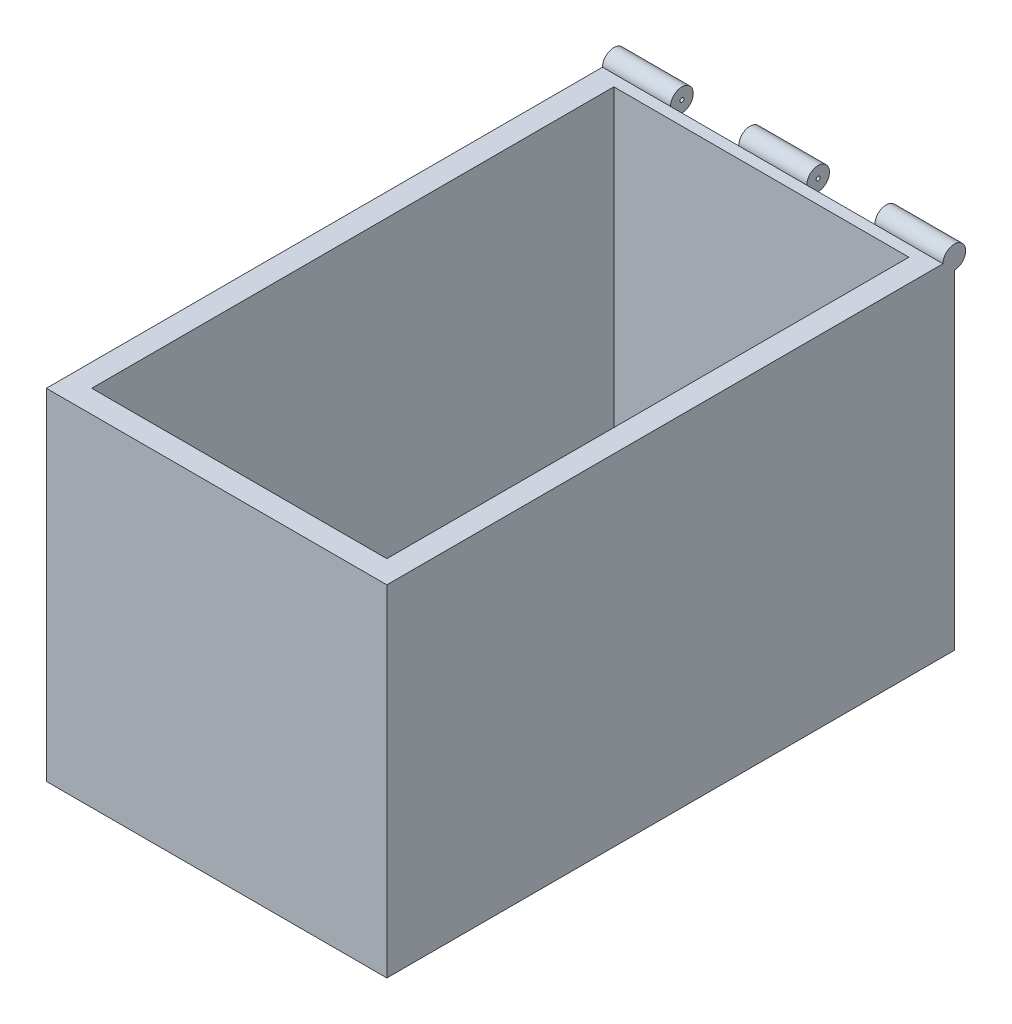
ISO-10303-21;
HEADER;
FILE_DESCRIPTION(('STEP AP214'),'2;1');
FILE_NAME('part.step','',(''),(''),'','','');
FILE_SCHEMA(('AUTOMOTIVE_DESIGN { 1 0 10303 214 1 1 1 1 }'));
ENDSEC;
DATA;
#1=APPLICATION_CONTEXT('core data for automotive mechanical design processes');
#2=APPLICATION_PROTOCOL_DEFINITION('international standard','automotive_design',2000,#1);
#3=PRODUCT_CONTEXT('',#1,'mechanical');
#4=PRODUCT('Part','Part','',(#3));
#5=PRODUCT_RELATED_PRODUCT_CATEGORY('part','',(#4));
#6=PRODUCT_DEFINITION_FORMATION('','',#4);
#7=PRODUCT_DEFINITION_CONTEXT('part definition',#1,'design');
#8=PRODUCT_DEFINITION('design','',#6,#7);
#9=PRODUCT_DEFINITION_SHAPE('','',#8);
#10=(LENGTH_UNIT() NAMED_UNIT(*) SI_UNIT(.MILLI.,.METRE.));
#11=(NAMED_UNIT(*) PLANE_ANGLE_UNIT() SI_UNIT($,.RADIAN.));
#12=(NAMED_UNIT(*) SI_UNIT($,.STERADIAN.) SOLID_ANGLE_UNIT());
#13=UNCERTAINTY_MEASURE_WITH_UNIT(LENGTH_MEASURE(1.E-05),#10,'distance_accuracy_value','');
#14=(GEOMETRIC_REPRESENTATION_CONTEXT(3) GLOBAL_UNCERTAINTY_ASSIGNED_CONTEXT((#13)) GLOBAL_UNIT_ASSIGNED_CONTEXT((#10,
#11,#12)) REPRESENTATION_CONTEXT('',''));
#15=CARTESIAN_POINT('',(0.,0.,0.));
#16=DIRECTION('',(0.,0.,1.));
#17=DIRECTION('',(1.,0.,0.));
#18=AXIS2_PLACEMENT_3D('',#15,#16,#17);
#19=CARTESIAN_POINT('',(0.,150.,250.));
#20=DIRECTION('',(0.,-1.,0.));
#21=DIRECTION('',(0.,0.,-1.));
#22=AXIS2_PLACEMENT_3D('',#19,#20,#21);
#23=PLANE('',#22);
#24=DIRECTION('',(-1.,0.,0.));
#25=VECTOR('',#24,1.);
#26=CARTESIAN_POINT('',(0.,150.,10.));
#27=LINE('',#26,#25);
#28=CARTESIAN_POINT('',(140.,150.,10.));
#29=VERTEX_POINT('',#28);
#30=CARTESIAN_POINT('',(10.,150.,10.));
#31=VERTEX_POINT('',#30);
#32=EDGE_CURVE('E358',#29,#31,#27,.T.);
#33=ORIENTED_EDGE('',*,*,#32,.F.);
#34=DIRECTION('',(0.,0.,-1.));
#35=VECTOR('',#34,1.);
#36=CARTESIAN_POINT('',(140.,150.,250.));
#37=LINE('',#36,#35);
#38=CARTESIAN_POINT('',(140.,150.,240.));
#39=VERTEX_POINT('',#38);
#40=EDGE_CURVE('E367',#39,#29,#37,.T.);
#41=ORIENTED_EDGE('',*,*,#40,.F.);
#42=DIRECTION('',(-1.,0.,0.));
#43=VECTOR('',#42,1.);
#44=CARTESIAN_POINT('',(0.,150.,240.));
#45=LINE('',#44,#43);
#46=CARTESIAN_POINT('',(10.,150.,240.));
#47=VERTEX_POINT('',#46);
#48=EDGE_CURVE('E378',#39,#47,#45,.T.);
#49=ORIENTED_EDGE('',*,*,#48,.T.);
#50=DIRECTION('',(0.,0.,-1.));
#51=VECTOR('',#50,1.);
#52=CARTESIAN_POINT('',(10.,150.,250.));
#53=LINE('',#52,#51);
#54=EDGE_CURVE('E379',#47,#31,#53,.T.);
#55=ORIENTED_EDGE('',*,*,#54,.T.);
#56=EDGE_LOOP('',(#33,#41,#49,#55));
#57=FACE_BOUND('',#56,.T.);
#58=DIRECTION('',(0.,0.,-1.));
#59=VECTOR('',#58,1.);
#60=CARTESIAN_POINT('',(150.,150.,250.));
#61=LINE('',#60,#59);
#62=CARTESIAN_POINT('',(150.,150.,250.));
#63=VERTEX_POINT('',#62);
#64=CARTESIAN_POINT('',(150.,150.,5.));
#65=VERTEX_POINT('',#64);
#66=EDGE_CURVE('E210',#63,#65,#61,.T.);
#67=ORIENTED_EDGE('',*,*,#66,.T.);
#68=DIRECTION('',(-1.,0.,0.));
#69=VECTOR('',#68,1.);
#70=CARTESIAN_POINT('',(150.,150.,5.));
#71=LINE('',#70,#69);
#72=CARTESIAN_POINT('',(120.,150.,5.));
#73=VERTEX_POINT('',#72);
#74=EDGE_CURVE('E190',#65,#73,#71,.T.);
#75=ORIENTED_EDGE('',*,*,#74,.T.);
#76=DIRECTION('',(-1.,0.,0.));
#77=VECTOR('',#76,1.);
#78=CARTESIAN_POINT('',(120.,150.,5.));
#79=LINE('',#78,#77);
#80=CARTESIAN_POINT('',(90.,150.,5.));
#81=VERTEX_POINT('',#80);
#82=EDGE_CURVE('E206',#81,#73,#79,.F.);
#83=ORIENTED_EDGE('',*,*,#82,.F.);
#84=DIRECTION('',(-1.,0.,0.));
#85=VECTOR('',#84,1.);
#86=CARTESIAN_POINT('',(90.,150.,5.00000000000001));
#87=LINE('',#86,#85);
#88=CARTESIAN_POINT('',(60.,150.,5.00000000000001));
#89=VERTEX_POINT('',#88);
#90=EDGE_CURVE('E242',#81,#89,#87,.T.);
#91=ORIENTED_EDGE('',*,*,#90,.T.);
#92=DIRECTION('',(-1.,0.,0.));
#93=VECTOR('',#92,1.);
#94=CARTESIAN_POINT('',(60.,150.,5.00000000000001));
#95=LINE('',#94,#93);
#96=CARTESIAN_POINT('',(30.,150.,5.00000000000001));
#97=VERTEX_POINT('',#96);
#98=EDGE_CURVE('E256',#97,#89,#95,.F.);
#99=ORIENTED_EDGE('',*,*,#98,.F.);
#100=DIRECTION('',(-1.,0.,0.));
#101=VECTOR('',#100,1.);
#102=CARTESIAN_POINT('',(30.,150.,5.));
#103=LINE('',#102,#101);
#104=CARTESIAN_POINT('',(0.,150.,5.));
#105=VERTEX_POINT('',#104);
#106=EDGE_CURVE('E264',#97,#105,#103,.T.);
#107=ORIENTED_EDGE('',*,*,#106,.T.);
#108=DIRECTION('',(0.,0.,-1.));
#109=VECTOR('',#108,1.);
#110=CARTESIAN_POINT('',(0.,150.,250.));
#111=LINE('',#110,#109);
#112=CARTESIAN_POINT('',(0.,150.,250.));
#113=VERTEX_POINT('',#112);
#114=EDGE_CURVE('E405',#113,#105,#111,.T.);
#115=ORIENTED_EDGE('',*,*,#114,.F.);
#116=DIRECTION('',(-1.,0.,0.));
#117=VECTOR('',#116,1.);
#118=CARTESIAN_POINT('',(0.,150.,250.));
#119=LINE('',#118,#117);
#120=EDGE_CURVE('E402',#63,#113,#119,.T.);
#121=ORIENTED_EDGE('',*,*,#120,.F.);
#122=EDGE_LOOP('',(#67,#75,#83,#91,#99,#107,#115,#121));
#123=FACE_BOUND('',#122,.T.);
#124=ADVANCED_FACE('F45',(#57,#123),#23,.F.);
#125=CARTESIAN_POINT('',(0.,0.,0.));
#126=DIRECTION('',(0.,0.,-1.));
#127=DIRECTION('',(-1.,0.,0.));
#128=AXIS2_PLACEMENT_3D('',#125,#126,#127);
#129=PLANE('',#128);
#130=DIRECTION('',(-1.,0.,0.));
#131=VECTOR('',#130,1.);
#132=CARTESIAN_POINT('',(150.,145.,0.));
#133=LINE('',#132,#131);
#134=CARTESIAN_POINT('',(150.,145.,0.));
#135=VERTEX_POINT('',#134);
#136=CARTESIAN_POINT('',(120.,145.,0.));
#137=VERTEX_POINT('',#136);
#138=EDGE_CURVE('E193',#135,#137,#133,.T.);
#139=ORIENTED_EDGE('',*,*,#138,.F.);
#140=DIRECTION('',(0.,1.,0.));
#141=VECTOR('',#140,1.);
#142=CARTESIAN_POINT('',(150.,0.,0.));
#143=LINE('',#142,#141);
#144=CARTESIAN_POINT('',(150.,0.,0.));
#145=VERTEX_POINT('',#144);
#146=EDGE_CURVE('E396',#145,#135,#143,.T.);
#147=ORIENTED_EDGE('',*,*,#146,.F.);
#148=DIRECTION('',(1.,0.,0.));
#149=VECTOR('',#148,1.);
#150=CARTESIAN_POINT('',(0.,0.,0.));
#151=LINE('',#150,#149);
#152=CARTESIAN_POINT('',(0.,0.,0.));
#153=VERTEX_POINT('',#152);
#154=EDGE_CURVE('E408',#153,#145,#151,.T.);
#155=ORIENTED_EDGE('',*,*,#154,.F.);
#156=DIRECTION('',(0.,-1.,0.));
#157=VECTOR('',#156,1.);
#158=CARTESIAN_POINT('',(0.,0.,0.));
#159=LINE('',#158,#157);
#160=CARTESIAN_POINT('',(0.,145.,0.));
#161=VERTEX_POINT('',#160);
#162=EDGE_CURVE('E351',#161,#153,#159,.T.);
#163=ORIENTED_EDGE('',*,*,#162,.F.);
#164=DIRECTION('',(-1.,0.,0.));
#165=VECTOR('',#164,1.);
#166=CARTESIAN_POINT('',(30.,145.,0.));
#167=LINE('',#166,#165);
#168=CARTESIAN_POINT('',(30.,145.,0.));
#169=VERTEX_POINT('',#168);
#170=EDGE_CURVE('E11',#169,#161,#167,.T.);
#171=ORIENTED_EDGE('',*,*,#170,.F.);
#172=DIRECTION('',(-1.,0.,0.));
#173=VECTOR('',#172,1.);
#174=CARTESIAN_POINT('',(60.,145.,0.));
#175=LINE('',#174,#173);
#176=CARTESIAN_POINT('',(60.,145.,0.));
#177=VERTEX_POINT('',#176);
#178=EDGE_CURVE('E250',#169,#177,#175,.F.);
#179=ORIENTED_EDGE('',*,*,#178,.T.);
#180=DIRECTION('',(-1.,0.,0.));
#181=VECTOR('',#180,1.);
#182=CARTESIAN_POINT('',(90.,145.,0.));
#183=LINE('',#182,#181);
#184=CARTESIAN_POINT('',(90.,145.,0.));
#185=VERTEX_POINT('',#184);
#186=EDGE_CURVE('E236',#185,#177,#183,.T.);
#187=ORIENTED_EDGE('',*,*,#186,.F.);
#188=DIRECTION('',(-1.,0.,0.));
#189=VECTOR('',#188,1.);
#190=CARTESIAN_POINT('',(120.,145.,0.));
#191=LINE('',#190,#189);
#192=EDGE_CURVE('E221',#185,#137,#191,.F.);
#193=ORIENTED_EDGE('',*,*,#192,.T.);
#194=EDGE_LOOP('',(#139,#147,#155,#163,#171,#179,#187,#193));
#195=FACE_BOUND('',#194,.T.);
#196=ADVANCED_FACE('F476',(#195),#129,.T.);
#197=CARTESIAN_POINT('',(0.,10.,250.));
#198=DIRECTION('',(0.,1.,0.));
#199=DIRECTION('',(0.,0.,1.));
#200=AXIS2_PLACEMENT_3D('',#197,#198,#199);
#201=PLANE('',#200);
#202=DIRECTION('',(1.,0.,0.));
#203=VECTOR('',#202,1.);
#204=CARTESIAN_POINT('',(0.,10.,10.));
#205=LINE('',#204,#203);
#206=CARTESIAN_POINT('',(110.,10.,10.));
#207=VERTEX_POINT('',#206);
#208=CARTESIAN_POINT('',(140.,10.,10.));
#209=VERTEX_POINT('',#208);
#210=EDGE_CURVE('E346',#207,#209,#205,.T.);
#211=ORIENTED_EDGE('',*,*,#210,.F.);
#212=DIRECTION('',(0.,0.,1.));
#213=VECTOR('',#212,1.);
#214=CARTESIAN_POINT('',(110.,10.,250.));
#215=LINE('',#214,#213);
#216=CARTESIAN_POINT('',(110.,10.,20.));
#217=VERTEX_POINT('',#216);
#218=EDGE_CURVE('E331',#207,#217,#215,.T.);
#219=ORIENTED_EDGE('',*,*,#218,.T.);
#220=DIRECTION('',(-1.,0.,0.));
#221=VECTOR('',#220,1.);
#222=CARTESIAN_POINT('',(0.,10.,20.));
#223=LINE('',#222,#221);
#224=CARTESIAN_POINT('',(40.,10.,20.));
#225=VERTEX_POINT('',#224);
#226=EDGE_CURVE('E55',#217,#225,#223,.T.);
#227=ORIENTED_EDGE('',*,*,#226,.T.);
#228=DIRECTION('',(0.,0.,-1.));
#229=VECTOR('',#228,1.);
#230=CARTESIAN_POINT('',(40.,10.,250.));
#231=LINE('',#230,#229);
#232=CARTESIAN_POINT('',(40.,10.,10.));
#233=VERTEX_POINT('',#232);
#234=EDGE_CURVE('E301',#225,#233,#231,.T.);
#235=ORIENTED_EDGE('',*,*,#234,.T.);
#236=CARTESIAN_POINT('',(10.,10.,10.));
#237=VERTEX_POINT('',#236);
#238=EDGE_CURVE('E359',#237,#233,#205,.T.);
#239=ORIENTED_EDGE('',*,*,#238,.F.);
#240=DIRECTION('',(0.,0.,-1.));
#241=VECTOR('',#240,1.);
#242=CARTESIAN_POINT('',(10.,10.,250.));
#243=LINE('',#242,#241);
#244=CARTESIAN_POINT('',(10.,10.,240.));
#245=VERTEX_POINT('',#244);
#246=EDGE_CURVE('E347',#245,#237,#243,.T.);
#247=ORIENTED_EDGE('',*,*,#246,.F.);
#248=DIRECTION('',(1.,0.,0.));
#249=VECTOR('',#248,1.);
#250=CARTESIAN_POINT('',(0.,10.,240.));
#251=LINE('',#250,#249);
#252=CARTESIAN_POINT('',(40.,10.,240.));
#253=VERTEX_POINT('',#252);
#254=EDGE_CURVE('E368',#245,#253,#251,.T.);
#255=ORIENTED_EDGE('',*,*,#254,.T.);
#256=DIRECTION('',(0.,0.,-1.));
#257=VECTOR('',#256,1.);
#258=CARTESIAN_POINT('',(40.,10.,250.));
#259=LINE('',#258,#257);
#260=CARTESIAN_POINT('',(40.,10.,230.));
#261=VERTEX_POINT('',#260);
#262=EDGE_CURVE('E334',#253,#261,#259,.T.);
#263=ORIENTED_EDGE('',*,*,#262,.T.);
#264=DIRECTION('',(1.,0.,0.));
#265=VECTOR('',#264,1.);
#266=CARTESIAN_POINT('',(0.,10.,230.));
#267=LINE('',#266,#265);
#268=CARTESIAN_POINT('',(110.,10.,230.));
#269=VERTEX_POINT('',#268);
#270=EDGE_CURVE('E426',#261,#269,#267,.T.);
#271=ORIENTED_EDGE('',*,*,#270,.T.);
#272=DIRECTION('',(0.,0.,1.));
#273=VECTOR('',#272,1.);
#274=CARTESIAN_POINT('',(110.,10.,250.));
#275=LINE('',#274,#273);
#276=CARTESIAN_POINT('',(110.,10.,240.));
#277=VERTEX_POINT('',#276);
#278=EDGE_CURVE('E338',#269,#277,#275,.T.);
#279=ORIENTED_EDGE('',*,*,#278,.T.);
#280=CARTESIAN_POINT('',(140.,10.,240.));
#281=VERTEX_POINT('',#280);
#282=EDGE_CURVE('E357',#277,#281,#251,.T.);
#283=ORIENTED_EDGE('',*,*,#282,.T.);
#284=DIRECTION('',(0.,0.,-1.));
#285=VECTOR('',#284,1.);
#286=CARTESIAN_POINT('',(140.,10.,250.));
#287=LINE('',#286,#285);
#288=EDGE_CURVE('E352',#281,#209,#287,.T.);
#289=ORIENTED_EDGE('',*,*,#288,.T.);
#290=EDGE_LOOP('',(#211,#219,#227,#235,#239,#247,#255,#263,#271,#279,#283,#289));
#291=FACE_BOUND('',#290,.T.);
#292=ADVANCED_FACE('F440',(#291),#201,.T.);
#293=CARTESIAN_POINT('',(0.,0.,240.));
#294=DIRECTION('',(0.,0.,-1.));
#295=DIRECTION('',(-1.,0.,0.));
#296=AXIS2_PLACEMENT_3D('',#293,#294,#295);
#297=PLANE('',#296);
#298=ORIENTED_EDGE('',*,*,#282,.F.);
#299=DIRECTION('',(0.,-1.,0.));
#300=VECTOR('',#299,1.);
#301=CARTESIAN_POINT('',(110.,40.,240.));
#302=LINE('',#301,#300);
#303=CARTESIAN_POINT('',(110.,40.,240.));
#304=VERTEX_POINT('',#303);
#305=EDGE_CURVE('E313',#304,#277,#302,.T.);
#306=ORIENTED_EDGE('',*,*,#305,.F.);
#307=DIRECTION('',(1.,0.,0.));
#308=VECTOR('',#307,1.);
#309=CARTESIAN_POINT('',(110.,40.,240.));
#310=LINE('',#309,#308);
#311=CARTESIAN_POINT('',(40.,40.,240.));
#312=VERTEX_POINT('',#311);
#313=EDGE_CURVE('E316',#312,#304,#310,.T.);
#314=ORIENTED_EDGE('',*,*,#313,.F.);
#315=DIRECTION('',(0.,-1.,0.));
#316=VECTOR('',#315,1.);
#317=CARTESIAN_POINT('',(40.,40.,240.));
#318=LINE('',#317,#316);
#319=EDGE_CURVE('E309',#312,#253,#318,.T.);
#320=ORIENTED_EDGE('',*,*,#319,.T.);
#321=ORIENTED_EDGE('',*,*,#254,.F.);
#322=DIRECTION('',(0.,-1.,0.));
#323=VECTOR('',#322,1.);
#324=CARTESIAN_POINT('',(10.,0.,240.));
#325=LINE('',#324,#323);
#326=EDGE_CURVE('E353',#47,#245,#325,.T.);
#327=ORIENTED_EDGE('',*,*,#326,.F.);
#328=ORIENTED_EDGE('',*,*,#48,.F.);
#329=DIRECTION('',(0.,1.,0.));
#330=VECTOR('',#329,1.);
#331=CARTESIAN_POINT('',(140.,0.,240.));
#332=LINE('',#331,#330);
#333=EDGE_CURVE('E372',#281,#39,#332,.T.);
#334=ORIENTED_EDGE('',*,*,#333,.F.);
#335=EDGE_LOOP('',(#298,#306,#314,#320,#321,#327,#328,#334));
#336=FACE_BOUND('',#335,.T.);
#337=ADVANCED_FACE('F616',(#336),#297,.T.);
#338=CARTESIAN_POINT('',(0.,0.,10.));
#339=DIRECTION('',(0.,0.,-1.));
#340=DIRECTION('',(-1.,0.,0.));
#341=AXIS2_PLACEMENT_3D('',#338,#339,#340);
#342=PLANE('',#341);
#343=DIRECTION('',(0.,-1.,0.));
#344=VECTOR('',#343,1.);
#345=CARTESIAN_POINT('',(110.,40.,10.));
#346=LINE('',#345,#344);
#347=CARTESIAN_POINT('',(110.,40.,10.));
#348=VERTEX_POINT('',#347);
#349=EDGE_CURVE('E298',#348,#207,#346,.T.);
#350=ORIENTED_EDGE('',*,*,#349,.T.);
#351=ORIENTED_EDGE('',*,*,#210,.T.);
#352=DIRECTION('',(0.,1.,0.));
#353=VECTOR('',#352,1.);
#354=CARTESIAN_POINT('',(140.,0.,10.));
#355=LINE('',#354,#353);
#356=EDGE_CURVE('E363',#209,#29,#355,.T.);
#357=ORIENTED_EDGE('',*,*,#356,.T.);
#358=ORIENTED_EDGE('',*,*,#32,.T.);
#359=DIRECTION('',(0.,-1.,0.));
#360=VECTOR('',#359,1.);
#361=CARTESIAN_POINT('',(10.,0.,10.));
#362=LINE('',#361,#360);
#363=EDGE_CURVE('E342',#31,#237,#362,.T.);
#364=ORIENTED_EDGE('',*,*,#363,.T.);
#365=ORIENTED_EDGE('',*,*,#238,.T.);
#366=DIRECTION('',(0.,-1.,0.));
#367=VECTOR('',#366,1.);
#368=CARTESIAN_POINT('',(40.,40.,10.));
#369=LINE('',#368,#367);
#370=CARTESIAN_POINT('',(40.,40.,10.));
#371=VERTEX_POINT('',#370);
#372=EDGE_CURVE('E294',#371,#233,#369,.T.);
#373=ORIENTED_EDGE('',*,*,#372,.F.);
#374=DIRECTION('',(-1.,0.,0.));
#375=VECTOR('',#374,1.);
#376=CARTESIAN_POINT('',(40.,40.,10.));
#377=LINE('',#376,#375);
#378=EDGE_CURVE('E275',#348,#371,#377,.T.);
#379=ORIENTED_EDGE('',*,*,#378,.F.);
#380=EDGE_LOOP('',(#350,#351,#357,#358,#364,#365,#373,#379));
#381=FACE_BOUND('',#380,.T.);
#382=ADVANCED_FACE('F435',(#381),#342,.F.);
#383=CARTESIAN_POINT('',(0.,0.,250.));
#384=DIRECTION('',(1.,0.,0.));
#385=DIRECTION('',(0.,0.,-1.));
#386=AXIS2_PLACEMENT_3D('',#383,#384,#385);
#387=PLANE('',#386);
#388=CARTESIAN_POINT('',(0.,150.,0.));
#389=DIRECTION('',(-1.,0.,0.));
#390=DIRECTION('',(0.,0.,1.));
#391=AXIS2_PLACEMENT_3D('',#388,#389,#390);
#392=CIRCLE('',#391,0.875);
#393=CARTESIAN_POINT('',(0.,150.,0.875));
#394=VERTEX_POINT('',#393);
#395=EDGE_CURVE('E521',#394,#394,#392,.T.);
#396=ORIENTED_EDGE('',*,*,#395,.F.);
#397=EDGE_LOOP('',(#396));
#398=FACE_BOUND('',#397,.T.);
#399=ORIENTED_EDGE('',*,*,#114,.T.);
#400=CARTESIAN_POINT('',(0.,150.,0.));
#401=DIRECTION('',(-1.,0.,0.));
#402=DIRECTION('',(0.,0.,1.));
#403=AXIS2_PLACEMENT_3D('',#400,#401,#402);
#404=CIRCLE('',#403,5.);
#405=EDGE_CURVE('E62',#105,#161,#404,.T.);
#406=ORIENTED_EDGE('',*,*,#405,.T.);
#407=ORIENTED_EDGE('',*,*,#162,.T.);
#408=DIRECTION('',(0.,0.,-1.));
#409=VECTOR('',#408,1.);
#410=CARTESIAN_POINT('',(0.,0.,250.));
#411=LINE('',#410,#409);
#412=CARTESIAN_POINT('',(0.,0.,250.));
#413=VERTEX_POINT('',#412);
#414=EDGE_CURVE('E422',#413,#153,#411,.T.);
#415=ORIENTED_EDGE('',*,*,#414,.F.);
#416=DIRECTION('',(0.,-1.,0.));
#417=VECTOR('',#416,1.);
#418=CARTESIAN_POINT('',(0.,0.,250.));
#419=LINE('',#418,#417);
#420=EDGE_CURVE('E391',#113,#413,#419,.T.);
#421=ORIENTED_EDGE('',*,*,#420,.F.);
#422=EDGE_LOOP('',(#399,#406,#407,#415,#421));
#423=FACE_BOUND('',#422,.T.);
#424=ADVANCED_FACE('F47',(#398,#423),#387,.F.);
#425=CARTESIAN_POINT('',(0.,0.,250.));
#426=DIRECTION('',(0.,1.,0.));
#427=DIRECTION('',(0.,0.,1.));
#428=AXIS2_PLACEMENT_3D('',#425,#426,#427);
#429=PLANE('',#428);
#430=ORIENTED_EDGE('',*,*,#154,.T.);
#431=DIRECTION('',(0.,0.,-1.));
#432=VECTOR('',#431,1.);
#433=CARTESIAN_POINT('',(150.,0.,250.));
#434=LINE('',#433,#432);
#435=CARTESIAN_POINT('',(150.,0.,250.));
#436=VERTEX_POINT('',#435);
#437=EDGE_CURVE('E418',#436,#145,#434,.T.);
#438=ORIENTED_EDGE('',*,*,#437,.F.);
#439=DIRECTION('',(1.,0.,0.));
#440=VECTOR('',#439,1.);
#441=CARTESIAN_POINT('',(0.,0.,250.));
#442=LINE('',#441,#440);
#443=EDGE_CURVE('E395',#413,#436,#442,.T.);
#444=ORIENTED_EDGE('',*,*,#443,.F.);
#445=ORIENTED_EDGE('',*,*,#414,.T.);
#446=EDGE_LOOP('',(#430,#438,#444,#445));
#447=FACE_BOUND('',#446,.T.);
#448=ADVANCED_FACE('F489',(#447),#429,.F.);
#449=CARTESIAN_POINT('',(150.,0.,250.));
#450=DIRECTION('',(-1.,0.,0.));
#451=DIRECTION('',(0.,0.,1.));
#452=AXIS2_PLACEMENT_3D('',#449,#450,#451);
#453=PLANE('',#452);
#454=ORIENTED_EDGE('',*,*,#146,.T.);
#455=CARTESIAN_POINT('',(150.,150.,0.));
#456=DIRECTION('',(-1.,0.,0.));
#457=DIRECTION('',(0.,0.,1.));
#458=AXIS2_PLACEMENT_3D('',#455,#456,#457);
#459=CIRCLE('',#458,5.);
#460=EDGE_CURVE('E198',#65,#135,#459,.T.);
#461=ORIENTED_EDGE('',*,*,#460,.F.);
#462=ORIENTED_EDGE('',*,*,#66,.F.);
#463=DIRECTION('',(0.,1.,0.));
#464=VECTOR('',#463,1.);
#465=CARTESIAN_POINT('',(150.,0.,250.));
#466=LINE('',#465,#464);
#467=EDGE_CURVE('E399',#436,#63,#466,.T.);
#468=ORIENTED_EDGE('',*,*,#467,.F.);
#469=ORIENTED_EDGE('',*,*,#437,.T.);
#470=EDGE_LOOP('',(#454,#461,#462,#468,#469));
#471=FACE_BOUND('',#470,.T.);
#472=ADVANCED_FACE('F486',(#471),#453,.F.);
#473=CARTESIAN_POINT('',(0.,0.,250.));
#474=DIRECTION('',(0.,0.,-1.));
#475=DIRECTION('',(-1.,0.,0.));
#476=AXIS2_PLACEMENT_3D('',#473,#474,#475);
#477=PLANE('',#476);
#478=ORIENTED_EDGE('',*,*,#420,.T.);
#479=ORIENTED_EDGE('',*,*,#443,.T.);
#480=ORIENTED_EDGE('',*,*,#467,.T.);
#481=ORIENTED_EDGE('',*,*,#120,.T.);
#482=EDGE_LOOP('',(#478,#479,#480,#481));
#483=FACE_BOUND('',#482,.T.);
#484=ADVANCED_FACE('F488',(#483),#477,.F.);
#485=CARTESIAN_POINT('',(10.,0.,250.));
#486=DIRECTION('',(1.,0.,0.));
#487=DIRECTION('',(0.,0.,-1.));
#488=AXIS2_PLACEMENT_3D('',#485,#486,#487);
#489=PLANE('',#488);
#490=ORIENTED_EDGE('',*,*,#363,.F.);
#491=ORIENTED_EDGE('',*,*,#54,.F.);
#492=ORIENTED_EDGE('',*,*,#326,.T.);
#493=ORIENTED_EDGE('',*,*,#246,.T.);
#494=EDGE_LOOP('',(#490,#491,#492,#493));
#495=FACE_BOUND('',#494,.T.);
#496=ADVANCED_FACE('F450',(#495),#489,.T.);
#497=CARTESIAN_POINT('',(140.,0.,250.));
#498=DIRECTION('',(-1.,0.,0.));
#499=DIRECTION('',(0.,0.,1.));
#500=AXIS2_PLACEMENT_3D('',#497,#498,#499);
#501=PLANE('',#500);
#502=ORIENTED_EDGE('',*,*,#356,.F.);
#503=ORIENTED_EDGE('',*,*,#288,.F.);
#504=ORIENTED_EDGE('',*,*,#333,.T.);
#505=ORIENTED_EDGE('',*,*,#40,.T.);
#506=EDGE_LOOP('',(#502,#503,#504,#505));
#507=FACE_BOUND('',#506,.T.);
#508=ADVANCED_FACE('F444',(#507),#501,.T.);
#509=CARTESIAN_POINT('',(110.,40.,20.));
#510=DIRECTION('',(-1.,0.,0.));
#511=DIRECTION('',(0.,0.,1.));
#512=AXIS2_PLACEMENT_3D('',#509,#510,#511);
#513=PLANE('',#512);
#514=ORIENTED_EDGE('',*,*,#218,.F.);
#515=ORIENTED_EDGE('',*,*,#349,.F.);
#516=DIRECTION('',(0.,0.,-1.));
#517=VECTOR('',#516,1.);
#518=CARTESIAN_POINT('',(110.,40.,20.));
#519=LINE('',#518,#517);
#520=CARTESIAN_POINT('',(110.,40.,20.));
#521=VERTEX_POINT('',#520);
#522=EDGE_CURVE('E271',#521,#348,#519,.T.);
#523=ORIENTED_EDGE('',*,*,#522,.F.);
#524=DIRECTION('',(0.,-1.,0.));
#525=VECTOR('',#524,1.);
#526=CARTESIAN_POINT('',(110.,40.,20.));
#527=LINE('',#526,#525);
#528=EDGE_CURVE('E286',#521,#217,#527,.T.);
#529=ORIENTED_EDGE('',*,*,#528,.T.);
#530=EDGE_LOOP('',(#514,#515,#523,#529));
#531=FACE_BOUND('',#530,.T.);
#532=ADVANCED_FACE('F463',(#531),#513,.F.);
#533=CARTESIAN_POINT('',(40.,40.,20.));
#534=DIRECTION('',(1.,0.,0.));
#535=DIRECTION('',(0.,0.,-1.));
#536=AXIS2_PLACEMENT_3D('',#533,#534,#535);
#537=PLANE('',#536);
#538=ORIENTED_EDGE('',*,*,#234,.F.);
#539=DIRECTION('',(0.,-1.,0.));
#540=VECTOR('',#539,1.);
#541=CARTESIAN_POINT('',(40.,40.,20.));
#542=LINE('',#541,#540);
#543=CARTESIAN_POINT('',(40.,40.,20.));
#544=VERTEX_POINT('',#543);
#545=EDGE_CURVE('E290',#544,#225,#542,.T.);
#546=ORIENTED_EDGE('',*,*,#545,.F.);
#547=DIRECTION('',(0.,0.,1.));
#548=VECTOR('',#547,1.);
#549=CARTESIAN_POINT('',(40.,40.,20.));
#550=LINE('',#549,#548);
#551=EDGE_CURVE('E280',#371,#544,#550,.T.);
#552=ORIENTED_EDGE('',*,*,#551,.F.);
#553=ORIENTED_EDGE('',*,*,#372,.T.);
#554=EDGE_LOOP('',(#538,#546,#552,#553));
#555=FACE_BOUND('',#554,.T.);
#556=ADVANCED_FACE('F455',(#555),#537,.F.);
#557=CARTESIAN_POINT('',(40.,40.,20.));
#558=DIRECTION('',(0.,0.,-1.));
#559=DIRECTION('',(-1.,0.,0.));
#560=AXIS2_PLACEMENT_3D('',#557,#558,#559);
#561=PLANE('',#560);
#562=ORIENTED_EDGE('',*,*,#226,.F.);
#563=ORIENTED_EDGE('',*,*,#528,.F.);
#564=DIRECTION('',(1.,0.,0.));
#565=VECTOR('',#564,1.);
#566=CARTESIAN_POINT('',(40.,40.,20.));
#567=LINE('',#566,#565);
#568=EDGE_CURVE('E283',#544,#521,#567,.T.);
#569=ORIENTED_EDGE('',*,*,#568,.F.);
#570=ORIENTED_EDGE('',*,*,#545,.T.);
#571=EDGE_LOOP('',(#562,#563,#569,#570));
#572=FACE_BOUND('',#571,.T.);
#573=ADVANCED_FACE('F465',(#572),#561,.F.);
#574=CARTESIAN_POINT('',(0.,40.,0.));
#575=DIRECTION('',(0.,-1.,0.));
#576=DIRECTION('',(0.,0.,-1.));
#577=AXIS2_PLACEMENT_3D('',#574,#575,#576);
#578=PLANE('',#577);
#579=ORIENTED_EDGE('',*,*,#522,.T.);
#580=ORIENTED_EDGE('',*,*,#378,.T.);
#581=ORIENTED_EDGE('',*,*,#551,.T.);
#582=ORIENTED_EDGE('',*,*,#568,.T.);
#583=EDGE_LOOP('',(#579,#580,#581,#582));
#584=FACE_BOUND('',#583,.T.);
#585=ADVANCED_FACE('F459',(#584),#578,.F.);
#586=CARTESIAN_POINT('',(110.,40.,240.));
#587=DIRECTION('',(-1.,0.,0.));
#588=DIRECTION('',(0.,0.,1.));
#589=AXIS2_PLACEMENT_3D('',#586,#587,#588);
#590=PLANE('',#589);
#591=ORIENTED_EDGE('',*,*,#278,.F.);
#592=DIRECTION('',(0.,-1.,0.));
#593=VECTOR('',#592,1.);
#594=CARTESIAN_POINT('',(110.,40.,230.));
#595=LINE('',#594,#593);
#596=CARTESIAN_POINT('',(110.,40.,230.));
#597=VERTEX_POINT('',#596);
#598=EDGE_CURVE('E270',#597,#269,#595,.T.);
#599=ORIENTED_EDGE('',*,*,#598,.F.);
#600=DIRECTION('',(0.,0.,-1.));
#601=VECTOR('',#600,1.);
#602=CARTESIAN_POINT('',(110.,40.,240.));
#603=LINE('',#602,#601);
#604=EDGE_CURVE('E276',#304,#597,#603,.T.);
#605=ORIENTED_EDGE('',*,*,#604,.F.);
#606=ORIENTED_EDGE('',*,*,#305,.T.);
#607=EDGE_LOOP('',(#591,#599,#605,#606));
#608=FACE_BOUND('',#607,.T.);
#609=ADVANCED_FACE('F472',(#608),#590,.F.);
#610=CARTESIAN_POINT('',(40.,40.,230.));
#611=DIRECTION('',(0.,0.,1.));
#612=DIRECTION('',(1.,0.,0.));
#613=AXIS2_PLACEMENT_3D('',#610,#611,#612);
#614=PLANE('',#613);
#615=ORIENTED_EDGE('',*,*,#270,.F.);
#616=DIRECTION('',(0.,-1.,0.));
#617=VECTOR('',#616,1.);
#618=CARTESIAN_POINT('',(40.,40.,230.));
#619=LINE('',#618,#617);
#620=CARTESIAN_POINT('',(40.,40.,230.));
#621=VERTEX_POINT('',#620);
#622=EDGE_CURVE('E305',#621,#261,#619,.T.);
#623=ORIENTED_EDGE('',*,*,#622,.F.);
#624=DIRECTION('',(-1.,0.,0.));
#625=VECTOR('',#624,1.);
#626=CARTESIAN_POINT('',(40.,40.,230.));
#627=LINE('',#626,#625);
#628=EDGE_CURVE('E323',#597,#621,#627,.T.);
#629=ORIENTED_EDGE('',*,*,#628,.F.);
#630=ORIENTED_EDGE('',*,*,#598,.T.);
#631=EDGE_LOOP('',(#615,#623,#629,#630));
#632=FACE_BOUND('',#631,.T.);
#633=ADVANCED_FACE('F607',(#632),#614,.F.);
#634=CARTESIAN_POINT('',(40.,40.,230.));
#635=DIRECTION('',(1.,0.,0.));
#636=DIRECTION('',(0.,0.,-1.));
#637=AXIS2_PLACEMENT_3D('',#634,#635,#636);
#638=PLANE('',#637);
#639=ORIENTED_EDGE('',*,*,#262,.F.);
#640=ORIENTED_EDGE('',*,*,#319,.F.);
#641=DIRECTION('',(0.,0.,1.));
#642=VECTOR('',#641,1.);
#643=CARTESIAN_POINT('',(40.,40.,230.));
#644=LINE('',#643,#642);
#645=EDGE_CURVE('E319',#621,#312,#644,.T.);
#646=ORIENTED_EDGE('',*,*,#645,.F.);
#647=ORIENTED_EDGE('',*,*,#622,.T.);
#648=EDGE_LOOP('',(#639,#640,#646,#647));
#649=FACE_BOUND('',#648,.T.);
#650=ADVANCED_FACE('F601',(#649),#638,.F.);
#651=CARTESIAN_POINT('',(0.,40.,0.));
#652=DIRECTION('',(0.,-1.,0.));
#653=DIRECTION('',(0.,0.,-1.));
#654=AXIS2_PLACEMENT_3D('',#651,#652,#653);
#655=PLANE('',#654);
#656=ORIENTED_EDGE('',*,*,#604,.T.);
#657=ORIENTED_EDGE('',*,*,#628,.T.);
#658=ORIENTED_EDGE('',*,*,#645,.T.);
#659=ORIENTED_EDGE('',*,*,#313,.T.);
#660=EDGE_LOOP('',(#656,#657,#658,#659));
#661=FACE_BOUND('',#660,.T.);
#662=ADVANCED_FACE('F597',(#661),#655,.F.);
#663=CARTESIAN_POINT('',(30.,150.,0.));
#664=DIRECTION('',(-1.,0.,0.));
#665=DIRECTION('',(0.,0.,1.));
#666=AXIS2_PLACEMENT_3D('',#663,#664,#665);
#667=CYLINDRICAL_SURFACE('',#666,5.);
#668=ORIENTED_EDGE('',*,*,#106,.F.);
#669=CARTESIAN_POINT('',(30.,150.,0.));
#670=DIRECTION('',(-1.,0.,0.));
#671=DIRECTION('',(0.,0.,1.));
#672=AXIS2_PLACEMENT_3D('',#669,#670,#671);
#673=CIRCLE('',#672,5.);
#674=EDGE_CURVE('E260',#97,#169,#673,.T.);
#675=ORIENTED_EDGE('',*,*,#674,.T.);
#676=ORIENTED_EDGE('',*,*,#170,.T.);
#677=ORIENTED_EDGE('',*,*,#405,.F.);
#678=EDGE_LOOP('',(#668,#675,#676,#677));
#679=FACE_BOUND('',#678,.T.);
#680=ADVANCED_FACE('F561',(#679),#667,.T.);
#681=CARTESIAN_POINT('',(30.,150.,0.));
#682=DIRECTION('',(-1.,0.,0.));
#683=DIRECTION('',(0.,0.,1.));
#684=AXIS2_PLACEMENT_3D('',#681,#682,#683);
#685=PLANE('',#684);
#686=CARTESIAN_POINT('',(30.,150.,0.));
#687=DIRECTION('',(-1.,0.,0.));
#688=DIRECTION('',(0.,0.,1.));
#689=AXIS2_PLACEMENT_3D('',#686,#687,#688);
#690=CIRCLE('',#689,0.875);
#691=CARTESIAN_POINT('',(30.,150.,0.875));
#692=VERTEX_POINT('',#691);
#693=EDGE_CURVE('E199',#692,#692,#690,.T.);
#694=ORIENTED_EDGE('',*,*,#693,.T.);
#695=EDGE_LOOP('',(#694));
#696=FACE_BOUND('',#695,.T.);
#697=ORIENTED_EDGE('',*,*,#674,.F.);
#698=CARTESIAN_POINT('',(30.,150.,0.));
#699=DIRECTION('',(1.,0.,0.));
#700=DIRECTION('',(0.,0.,-1.));
#701=AXIS2_PLACEMENT_3D('',#698,#699,#700);
#702=CIRCLE('',#701,5.00000000000001);
#703=EDGE_CURVE('E245',#97,#169,#702,.T.);
#704=ORIENTED_EDGE('',*,*,#703,.T.);
#705=EDGE_LOOP('',(#697,#704));
#706=FACE_BOUND('',#705,.T.);
#707=ADVANCED_FACE('F557',(#696,#706),#685,.F.);
#708=CARTESIAN_POINT('',(60.,150.,0.));
#709=DIRECTION('',(1.,0.,0.));
#710=DIRECTION('',(0.,0.,-1.));
#711=AXIS2_PLACEMENT_3D('',#708,#709,#710);
#712=PLANE('',#711);
#713=CARTESIAN_POINT('',(60.,150.,0.));
#714=DIRECTION('',(1.,0.,0.));
#715=DIRECTION('',(0.,0.,-1.));
#716=AXIS2_PLACEMENT_3D('',#713,#714,#715);
#717=CIRCLE('',#716,0.875);
#718=CARTESIAN_POINT('',(60.,150.,-0.875));
#719=VERTEX_POINT('',#718);
#720=EDGE_CURVE('E513',#719,#719,#717,.T.);
#721=ORIENTED_EDGE('',*,*,#720,.T.);
#722=EDGE_LOOP('',(#721));
#723=FACE_BOUND('',#722,.T.);
#724=CARTESIAN_POINT('',(60.,150.,0.));
#725=DIRECTION('',(1.,0.,0.));
#726=DIRECTION('',(0.,0.,-1.));
#727=AXIS2_PLACEMENT_3D('',#724,#725,#726);
#728=CIRCLE('',#727,5.00000000000001);
#729=EDGE_CURVE('E246',#89,#177,#728,.T.);
#730=ORIENTED_EDGE('',*,*,#729,.F.);
#731=CARTESIAN_POINT('',(60.,150.,0.));
#732=DIRECTION('',(-1.,0.,0.));
#733=DIRECTION('',(0.,0.,1.));
#734=AXIS2_PLACEMENT_3D('',#731,#732,#733);
#735=CIRCLE('',#734,5.00000000000001);
#736=EDGE_CURVE('E220',#89,#177,#735,.T.);
#737=ORIENTED_EDGE('',*,*,#736,.T.);
#738=EDGE_LOOP('',(#730,#737));
#739=FACE_BOUND('',#738,.T.);
#740=ADVANCED_FACE('F560',(#723,#739),#712,.F.);
#741=CARTESIAN_POINT('',(60.,150.,0.));
#742=DIRECTION('',(-1.,0.,0.));
#743=DIRECTION('',(0.,0.,1.));
#744=AXIS2_PLACEMENT_3D('',#741,#742,#743);
#745=CYLINDRICAL_SURFACE('',#744,5.00000000000001);
#746=ORIENTED_EDGE('',*,*,#98,.T.);
#747=ORIENTED_EDGE('',*,*,#729,.T.);
#748=ORIENTED_EDGE('',*,*,#178,.F.);
#749=ORIENTED_EDGE('',*,*,#703,.F.);
#750=EDGE_LOOP('',(#746,#747,#748,#749));
#751=FACE_BOUND('',#750,.T.);
#752=ADVANCED_FACE('F574',(#751),#745,.F.);
#753=CARTESIAN_POINT('',(90.,150.,0.));
#754=DIRECTION('',(-1.,0.,0.));
#755=DIRECTION('',(0.,0.,1.));
#756=AXIS2_PLACEMENT_3D('',#753,#754,#755);
#757=PLANE('',#756);
#758=CARTESIAN_POINT('',(90.,150.,0.));
#759=DIRECTION('',(-1.,0.,0.));
#760=DIRECTION('',(0.,0.,1.));
#761=AXIS2_PLACEMENT_3D('',#758,#759,#760);
#762=CIRCLE('',#761,0.875);
#763=CARTESIAN_POINT('',(90.,150.,0.875));
#764=VERTEX_POINT('',#763);
#765=EDGE_CURVE('E517',#764,#764,#762,.T.);
#766=ORIENTED_EDGE('',*,*,#765,.T.);
#767=EDGE_LOOP('',(#766));
#768=FACE_BOUND('',#767,.T.);
#769=CARTESIAN_POINT('',(90.,150.,0.));
#770=DIRECTION('',(-1.,0.,0.));
#771=DIRECTION('',(0.,0.,1.));
#772=AXIS2_PLACEMENT_3D('',#769,#770,#771);
#773=CIRCLE('',#772,5.00000000000001);
#774=EDGE_CURVE('E232',#81,#185,#773,.T.);
#775=ORIENTED_EDGE('',*,*,#774,.F.);
#776=CARTESIAN_POINT('',(90.,150.,0.));
#777=DIRECTION('',(1.,0.,0.));
#778=DIRECTION('',(0.,0.,-1.));
#779=AXIS2_PLACEMENT_3D('',#776,#777,#778);
#780=CIRCLE('',#779,5.);
#781=EDGE_CURVE('E212',#81,#185,#780,.T.);
#782=ORIENTED_EDGE('',*,*,#781,.T.);
#783=EDGE_LOOP('',(#775,#782));
#784=FACE_BOUND('',#783,.T.);
#785=ADVANCED_FACE('F580',(#768,#784),#757,.F.);
#786=CARTESIAN_POINT('',(90.,150.,0.));
#787=DIRECTION('',(-1.,0.,0.));
#788=DIRECTION('',(0.,0.,1.));
#789=AXIS2_PLACEMENT_3D('',#786,#787,#788);
#790=CYLINDRICAL_SURFACE('',#789,5.00000000000001);
#791=ORIENTED_EDGE('',*,*,#90,.F.);
#792=ORIENTED_EDGE('',*,*,#774,.T.);
#793=ORIENTED_EDGE('',*,*,#186,.T.);
#794=ORIENTED_EDGE('',*,*,#736,.F.);
#795=EDGE_LOOP('',(#791,#792,#793,#794));
#796=FACE_BOUND('',#795,.T.);
#797=ADVANCED_FACE('F577',(#796),#790,.T.);
#798=CARTESIAN_POINT('',(120.,150.,0.));
#799=DIRECTION('',(1.,0.,0.));
#800=DIRECTION('',(0.,0.,-1.));
#801=AXIS2_PLACEMENT_3D('',#798,#799,#800);
#802=PLANE('',#801);
#803=CARTESIAN_POINT('',(120.,150.,0.));
#804=DIRECTION('',(1.,0.,0.));
#805=DIRECTION('',(0.,0.,-1.));
#806=AXIS2_PLACEMENT_3D('',#803,#804,#805);
#807=CIRCLE('',#806,0.875);
#808=CARTESIAN_POINT('',(120.,150.,-0.875));
#809=VERTEX_POINT('',#808);
#810=EDGE_CURVE('E49',#809,#809,#807,.T.);
#811=ORIENTED_EDGE('',*,*,#810,.T.);
#812=EDGE_LOOP('',(#811));
#813=FACE_BOUND('',#812,.T.);
#814=CARTESIAN_POINT('',(120.,150.,0.));
#815=DIRECTION('',(1.,0.,0.));
#816=DIRECTION('',(0.,0.,-1.));
#817=AXIS2_PLACEMENT_3D('',#814,#815,#816);
#818=CIRCLE('',#817,5.);
#819=EDGE_CURVE('E217',#73,#137,#818,.T.);
#820=ORIENTED_EDGE('',*,*,#819,.F.);
#821=CARTESIAN_POINT('',(120.,150.,0.));
#822=DIRECTION('',(-1.,0.,0.));
#823=DIRECTION('',(0.,0.,1.));
#824=AXIS2_PLACEMENT_3D('',#821,#822,#823);
#825=CIRCLE('',#824,5.);
#826=EDGE_CURVE('E187',#73,#137,#825,.T.);
#827=ORIENTED_EDGE('',*,*,#826,.T.);
#828=EDGE_LOOP('',(#820,#827));
#829=FACE_BOUND('',#828,.T.);
#830=ADVANCED_FACE('F223',(#813,#829),#802,.F.);
#831=CARTESIAN_POINT('',(120.,150.,0.));
#832=DIRECTION('',(-1.,0.,0.));
#833=DIRECTION('',(0.,0.,1.));
#834=AXIS2_PLACEMENT_3D('',#831,#832,#833);
#835=CYLINDRICAL_SURFACE('',#834,5.);
#836=ORIENTED_EDGE('',*,*,#82,.T.);
#837=ORIENTED_EDGE('',*,*,#819,.T.);
#838=ORIENTED_EDGE('',*,*,#192,.F.);
#839=ORIENTED_EDGE('',*,*,#781,.F.);
#840=EDGE_LOOP('',(#836,#837,#838,#839));
#841=FACE_BOUND('',#840,.T.);
#842=ADVANCED_FACE('F215',(#841),#835,.F.);
#843=CARTESIAN_POINT('',(150.,150.,0.));
#844=DIRECTION('',(-1.,0.,0.));
#845=DIRECTION('',(0.,0.,1.));
#846=AXIS2_PLACEMENT_3D('',#843,#844,#845);
#847=CYLINDRICAL_SURFACE('',#846,5.);
#848=ORIENTED_EDGE('',*,*,#74,.F.);
#849=ORIENTED_EDGE('',*,*,#460,.T.);
#850=ORIENTED_EDGE('',*,*,#138,.T.);
#851=ORIENTED_EDGE('',*,*,#826,.F.);
#852=EDGE_LOOP('',(#848,#849,#850,#851));
#853=FACE_BOUND('',#852,.T.);
#854=ADVANCED_FACE('F189',(#853),#847,.T.);
#855=CARTESIAN_POINT('',(145.,150.,0.));
#856=DIRECTION('',(-1.,0.,0.));
#857=DIRECTION('',(0.,0.,1.));
#858=AXIS2_PLACEMENT_3D('',#855,#856,#857);
#859=PLANE('',#858);
#860=CARTESIAN_POINT('',(145.,150.,0.));
#861=DIRECTION('',(-1.,0.,0.));
#862=DIRECTION('',(0.,0.,1.));
#863=AXIS2_PLACEMENT_3D('',#860,#861,#862);
#864=CIRCLE('',#863,0.875);
#865=CARTESIAN_POINT('',(145.,150.,0.875));
#866=VERTEX_POINT('',#865);
#867=EDGE_CURVE('E525',#866,#866,#864,.T.);
#868=ORIENTED_EDGE('',*,*,#867,.T.);
#869=EDGE_LOOP('',(#868));
#870=FACE_BOUND('',#869,.T.);
#871=ADVANCED_FACE('F538',(#870),#859,.T.);
#872=CARTESIAN_POINT('',(145.,150.,0.));
#873=DIRECTION('',(-1.,0.,0.));
#874=DIRECTION('',(0.,0.,1.));
#875=AXIS2_PLACEMENT_3D('',#872,#873,#874);
#876=CYLINDRICAL_SURFACE('',#875,0.875);
#877=ORIENTED_EDGE('',*,*,#867,.F.);
#878=EDGE_LOOP('',(#877));
#879=FACE_BOUND('',#878,.T.);
#880=ORIENTED_EDGE('',*,*,#810,.F.);
#881=EDGE_LOOP('',(#880));
#882=FACE_BOUND('',#881,.T.);
#883=ADVANCED_FACE('F535',(#879,#882),#876,.F.);
#884=ORIENTED_EDGE('',*,*,#765,.F.);
#885=EDGE_LOOP('',(#884));
#886=FACE_BOUND('',#885,.T.);
#887=ORIENTED_EDGE('',*,*,#720,.F.);
#888=EDGE_LOOP('',(#887));
#889=FACE_BOUND('',#888,.T.);
#890=ADVANCED_FACE('F537',(#886,#889),#876,.F.);
#891=ORIENTED_EDGE('',*,*,#395,.T.);
#892=EDGE_LOOP('',(#891));
#893=FACE_BOUND('',#892,.T.);
#894=ORIENTED_EDGE('',*,*,#693,.F.);
#895=EDGE_LOOP('',(#894));
#896=FACE_BOUND('',#895,.T.);
#897=ADVANCED_FACE('F541',(#893,#896),#876,.F.);
#898=CLOSED_SHELL('',(#124,#196,#292,#337,#382,#424,#448,#472,#484,#496,#508,#532,#556,#573,
#585,#609,#633,#650,#662,#680,#707,#740,#752,#785,#797,#830,#842,#854,#871,#883,#890,#897));
#899=MANIFOLD_SOLID_BREP('B2',#898);
#900=ADVANCED_BREP_SHAPE_REPRESENTATION('',(#18,#899),#14);
#901=SHAPE_DEFINITION_REPRESENTATION(#9,#900);
ENDSEC;
END-ISO-10303-21;
